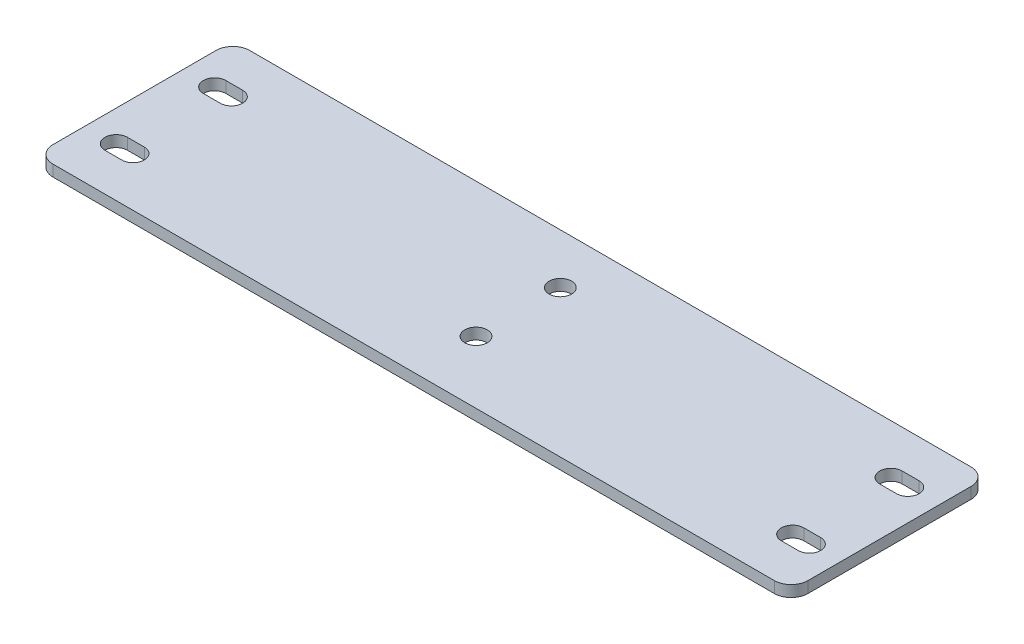
ISO-10303-21;
HEADER;
FILE_DESCRIPTION(('STEP AP214'),'2;1');
FILE_NAME('part.step','',(''),(''),'','','');
FILE_SCHEMA(('AUTOMOTIVE_DESIGN { 1 0 10303 214 1 1 1 1 }'));
ENDSEC;
DATA;
#1=APPLICATION_CONTEXT('core data for automotive mechanical design processes');
#2=APPLICATION_PROTOCOL_DEFINITION('international standard','automotive_design',2000,#1);
#3=PRODUCT_CONTEXT('',#1,'mechanical');
#4=PRODUCT('Part','Part','',(#3));
#5=PRODUCT_RELATED_PRODUCT_CATEGORY('part','',(#4));
#6=PRODUCT_DEFINITION_FORMATION('','',#4);
#7=PRODUCT_DEFINITION_CONTEXT('part definition',#1,'design');
#8=PRODUCT_DEFINITION('design','',#6,#7);
#9=PRODUCT_DEFINITION_SHAPE('','',#8);
#10=(LENGTH_UNIT() NAMED_UNIT(*) SI_UNIT(.MILLI.,.METRE.));
#11=(NAMED_UNIT(*) PLANE_ANGLE_UNIT() SI_UNIT($,.RADIAN.));
#12=(NAMED_UNIT(*) SI_UNIT($,.STERADIAN.) SOLID_ANGLE_UNIT());
#13=UNCERTAINTY_MEASURE_WITH_UNIT(LENGTH_MEASURE(1.E-05),#10,'distance_accuracy_value','');
#14=(GEOMETRIC_REPRESENTATION_CONTEXT(3) GLOBAL_UNCERTAINTY_ASSIGNED_CONTEXT((#13)) GLOBAL_UNIT_ASSIGNED_CONTEXT((#10,
#11,#12)) REPRESENTATION_CONTEXT('',''));
#15=CARTESIAN_POINT('',(0.,0.,0.));
#16=DIRECTION('',(0.,0.,1.));
#17=DIRECTION('',(1.,0.,0.));
#18=AXIS2_PLACEMENT_3D('',#15,#16,#17);
#19=CARTESIAN_POINT('',(64.15,-2.,14.5));
#20=DIRECTION('',(0.,1.,0.));
#21=DIRECTION('',(0.,0.,1.));
#22=AXIS2_PLACEMENT_3D('',#19,#20,#21);
#23=CYLINDRICAL_SURFACE('',#22,3.);
#24=CARTESIAN_POINT('',(64.15,0.,14.5));
#25=DIRECTION('',(0.,1.,0.));
#26=DIRECTION('',(0.,0.,1.));
#27=AXIS2_PLACEMENT_3D('',#24,#25,#26);
#28=CIRCLE('',#27,3.);
#29=CARTESIAN_POINT('',(64.15,0.,17.5));
#30=VERTEX_POINT('',#29);
#31=CARTESIAN_POINT('',(67.15,0.,14.5));
#32=VERTEX_POINT('',#31);
#33=EDGE_CURVE('E633',#30,#32,#28,.T.);
#34=ORIENTED_EDGE('',*,*,#33,.F.);
#35=DIRECTION('',(0.,1.,0.));
#36=VECTOR('',#35,1.);
#37=CARTESIAN_POINT('',(64.15,-2.,17.5));
#38=LINE('',#37,#36);
#39=CARTESIAN_POINT('',(64.15,-2.,17.5));
#40=VERTEX_POINT('',#39);
#41=EDGE_CURVE('E348',#40,#30,#38,.T.);
#42=ORIENTED_EDGE('',*,*,#41,.F.);
#43=CARTESIAN_POINT('',(64.15,-2.,14.5));
#44=DIRECTION('',(0.,1.,0.));
#45=DIRECTION('',(0.,0.,1.));
#46=AXIS2_PLACEMENT_3D('',#43,#44,#45);
#47=CIRCLE('',#46,3.);
#48=CARTESIAN_POINT('',(67.15,-2.,14.5));
#49=VERTEX_POINT('',#48);
#50=EDGE_CURVE('E634',#40,#49,#47,.T.);
#51=ORIENTED_EDGE('',*,*,#50,.T.);
#52=DIRECTION('',(0.,1.,0.));
#53=VECTOR('',#52,1.);
#54=CARTESIAN_POINT('',(67.15,-2.,14.5));
#55=LINE('',#54,#53);
#56=EDGE_CURVE('E659',#49,#32,#55,.T.);
#57=ORIENTED_EDGE('',*,*,#56,.T.);
#58=EDGE_LOOP('',(#34,#42,#51,#57));
#59=FACE_BOUND('',#58,.T.);
#60=ADVANCED_FACE('F340',(#59),#23,.T.);
#61=CARTESIAN_POINT('',(-64.15,-2.,17.5));
#62=DIRECTION('',(0.,0.,1.));
#63=DIRECTION('',(1.,0.,0.));
#64=AXIS2_PLACEMENT_3D('',#61,#62,#63);
#65=PLANE('',#64);
#66=DIRECTION('',(1.,0.,0.));
#67=VECTOR('',#66,1.);
#68=CARTESIAN_POINT('',(-64.15,0.,17.5));
#69=LINE('',#68,#67);
#70=CARTESIAN_POINT('',(-64.15,0.,17.5));
#71=VERTEX_POINT('',#70);
#72=EDGE_CURVE('E638',#71,#30,#69,.T.);
#73=ORIENTED_EDGE('',*,*,#72,.F.);
#74=DIRECTION('',(0.,1.,0.));
#75=VECTOR('',#74,1.);
#76=CARTESIAN_POINT('',(-64.15,-2.,17.5));
#77=LINE('',#76,#75);
#78=CARTESIAN_POINT('',(-64.15,-2.,17.5));
#79=VERTEX_POINT('',#78);
#80=EDGE_CURVE('E683',#79,#71,#77,.T.);
#81=ORIENTED_EDGE('',*,*,#80,.F.);
#82=DIRECTION('',(1.,0.,0.));
#83=VECTOR('',#82,1.);
#84=CARTESIAN_POINT('',(-64.15,-2.,17.5));
#85=LINE('',#84,#83);
#86=EDGE_CURVE('E656',#79,#40,#85,.T.);
#87=ORIENTED_EDGE('',*,*,#86,.T.);
#88=ORIENTED_EDGE('',*,*,#41,.T.);
#89=EDGE_LOOP('',(#73,#81,#87,#88));
#90=FACE_BOUND('',#89,.T.);
#91=ADVANCED_FACE('F707',(#90),#65,.T.);
#92=CARTESIAN_POINT('',(-64.15,-2.,14.5));
#93=DIRECTION('',(0.,1.,0.));
#94=DIRECTION('',(0.,0.,1.));
#95=AXIS2_PLACEMENT_3D('',#92,#93,#94);
#96=CYLINDRICAL_SURFACE('',#95,3.);
#97=CARTESIAN_POINT('',(-64.15,0.,14.5));
#98=DIRECTION('',(0.,1.,0.));
#99=DIRECTION('',(0.,0.,-1.));
#100=AXIS2_PLACEMENT_3D('',#97,#98,#99);
#101=CIRCLE('',#100,3.);
#102=CARTESIAN_POINT('',(-67.15,0.,14.5));
#103=VERTEX_POINT('',#102);
#104=EDGE_CURVE('E677',#103,#71,#101,.T.);
#105=ORIENTED_EDGE('',*,*,#104,.F.);
#106=DIRECTION('',(0.,1.,0.));
#107=VECTOR('',#106,1.);
#108=CARTESIAN_POINT('',(-67.15,-2.,14.5));
#109=LINE('',#108,#107);
#110=CARTESIAN_POINT('',(-67.15,-2.,14.5));
#111=VERTEX_POINT('',#110);
#112=EDGE_CURVE('E685',#111,#103,#109,.T.);
#113=ORIENTED_EDGE('',*,*,#112,.F.);
#114=CARTESIAN_POINT('',(-64.15,-2.,14.5));
#115=DIRECTION('',(0.,1.,0.));
#116=DIRECTION('',(0.,0.,-1.));
#117=AXIS2_PLACEMENT_3D('',#114,#115,#116);
#118=CIRCLE('',#117,3.);
#119=EDGE_CURVE('E653',#111,#79,#118,.T.);
#120=ORIENTED_EDGE('',*,*,#119,.T.);
#121=ORIENTED_EDGE('',*,*,#80,.T.);
#122=EDGE_LOOP('',(#105,#113,#120,#121));
#123=FACE_BOUND('',#122,.T.);
#124=ADVANCED_FACE('F728',(#123),#96,.T.);
#125=CARTESIAN_POINT('',(-67.15,-2.,-14.5));
#126=DIRECTION('',(-1.,0.,0.));
#127=DIRECTION('',(0.,0.,1.));
#128=AXIS2_PLACEMENT_3D('',#125,#126,#127);
#129=PLANE('',#128);
#130=DIRECTION('',(0.,0.,1.));
#131=VECTOR('',#130,1.);
#132=CARTESIAN_POINT('',(-67.15,0.,-14.5));
#133=LINE('',#132,#131);
#134=CARTESIAN_POINT('',(-67.15,0.,-14.5));
#135=VERTEX_POINT('',#134);
#136=EDGE_CURVE('E674',#135,#103,#133,.T.);
#137=ORIENTED_EDGE('',*,*,#136,.F.);
#138=DIRECTION('',(0.,1.,0.));
#139=VECTOR('',#138,1.);
#140=CARTESIAN_POINT('',(-67.15,-2.,-14.5));
#141=LINE('',#140,#139);
#142=CARTESIAN_POINT('',(-67.15,-2.,-14.5));
#143=VERTEX_POINT('',#142);
#144=EDGE_CURVE('E687',#143,#135,#141,.T.);
#145=ORIENTED_EDGE('',*,*,#144,.F.);
#146=DIRECTION('',(0.,0.,1.));
#147=VECTOR('',#146,1.);
#148=CARTESIAN_POINT('',(-67.15,-2.,-14.5));
#149=LINE('',#148,#147);
#150=EDGE_CURVE('E650',#143,#111,#149,.T.);
#151=ORIENTED_EDGE('',*,*,#150,.T.);
#152=ORIENTED_EDGE('',*,*,#112,.T.);
#153=EDGE_LOOP('',(#137,#145,#151,#152));
#154=FACE_BOUND('',#153,.T.);
#155=ADVANCED_FACE('F726',(#154),#129,.T.);
#156=CARTESIAN_POINT('',(-64.15,-2.,-14.5));
#157=DIRECTION('',(0.,1.,0.));
#158=DIRECTION('',(0.,0.,1.));
#159=AXIS2_PLACEMENT_3D('',#156,#157,#158);
#160=CYLINDRICAL_SURFACE('',#159,3.);
#161=CARTESIAN_POINT('',(-64.15,0.,-14.5));
#162=DIRECTION('',(0.,1.,0.));
#163=DIRECTION('',(0.,0.,-1.));
#164=AXIS2_PLACEMENT_3D('',#161,#162,#163);
#165=CIRCLE('',#164,3.);
#166=CARTESIAN_POINT('',(-64.15,0.,-17.5));
#167=VERTEX_POINT('',#166);
#168=EDGE_CURVE('E671',#167,#135,#165,.T.);
#169=ORIENTED_EDGE('',*,*,#168,.F.);
#170=DIRECTION('',(0.,1.,0.));
#171=VECTOR('',#170,1.);
#172=CARTESIAN_POINT('',(-64.15,-2.,-17.5));
#173=LINE('',#172,#171);
#174=CARTESIAN_POINT('',(-64.15,-2.,-17.5));
#175=VERTEX_POINT('',#174);
#176=EDGE_CURVE('E689',#175,#167,#173,.T.);
#177=ORIENTED_EDGE('',*,*,#176,.F.);
#178=CARTESIAN_POINT('',(-64.15,-2.,-14.5));
#179=DIRECTION('',(0.,1.,0.));
#180=DIRECTION('',(0.,0.,-1.));
#181=AXIS2_PLACEMENT_3D('',#178,#179,#180);
#182=CIRCLE('',#181,3.);
#183=EDGE_CURVE('E647',#175,#143,#182,.T.);
#184=ORIENTED_EDGE('',*,*,#183,.T.);
#185=ORIENTED_EDGE('',*,*,#144,.T.);
#186=EDGE_LOOP('',(#169,#177,#184,#185));
#187=FACE_BOUND('',#186,.T.);
#188=ADVANCED_FACE('F722',(#187),#160,.T.);
#189=CARTESIAN_POINT('',(-64.15,-2.,-17.5));
#190=DIRECTION('',(0.,0.,-1.));
#191=DIRECTION('',(-1.,0.,0.));
#192=AXIS2_PLACEMENT_3D('',#189,#190,#191);
#193=PLANE('',#192);
#194=DIRECTION('',(-1.,0.,0.));
#195=VECTOR('',#194,1.);
#196=CARTESIAN_POINT('',(-64.15,0.,-17.5));
#197=LINE('',#196,#195);
#198=CARTESIAN_POINT('',(64.15,0.,-17.5));
#199=VERTEX_POINT('',#198);
#200=EDGE_CURVE('E668',#199,#167,#197,.T.);
#201=ORIENTED_EDGE('',*,*,#200,.F.);
#202=DIRECTION('',(0.,1.,0.));
#203=VECTOR('',#202,1.);
#204=CARTESIAN_POINT('',(64.15,-2.,-17.5));
#205=LINE('',#204,#203);
#206=CARTESIAN_POINT('',(64.15,-2.,-17.5));
#207=VERTEX_POINT('',#206);
#208=EDGE_CURVE('E691',#207,#199,#205,.T.);
#209=ORIENTED_EDGE('',*,*,#208,.F.);
#210=DIRECTION('',(-1.,0.,0.));
#211=VECTOR('',#210,1.);
#212=CARTESIAN_POINT('',(-64.15,-2.,-17.5));
#213=LINE('',#212,#211);
#214=EDGE_CURVE('E644',#207,#175,#213,.T.);
#215=ORIENTED_EDGE('',*,*,#214,.T.);
#216=ORIENTED_EDGE('',*,*,#176,.T.);
#217=EDGE_LOOP('',(#201,#209,#215,#216));
#218=FACE_BOUND('',#217,.T.);
#219=ADVANCED_FACE('F720',(#218),#193,.T.);
#220=CARTESIAN_POINT('',(64.15,-2.,-14.5));
#221=DIRECTION('',(0.,1.,0.));
#222=DIRECTION('',(0.,0.,1.));
#223=AXIS2_PLACEMENT_3D('',#220,#221,#222);
#224=CYLINDRICAL_SURFACE('',#223,3.00000000000001);
#225=CARTESIAN_POINT('',(64.15,0.,-14.5));
#226=DIRECTION('',(0.,1.,0.));
#227=DIRECTION('',(0.,0.,1.));
#228=AXIS2_PLACEMENT_3D('',#225,#226,#227);
#229=CIRCLE('',#228,3.00000000000001);
#230=CARTESIAN_POINT('',(67.15,0.,-14.5));
#231=VERTEX_POINT('',#230);
#232=EDGE_CURVE('E665',#231,#199,#229,.T.);
#233=ORIENTED_EDGE('',*,*,#232,.F.);
#234=DIRECTION('',(0.,1.,0.));
#235=VECTOR('',#234,1.);
#236=CARTESIAN_POINT('',(67.15,-2.,-14.5));
#237=LINE('',#236,#235);
#238=CARTESIAN_POINT('',(67.15,-2.,-14.5));
#239=VERTEX_POINT('',#238);
#240=EDGE_CURVE('E693',#239,#231,#237,.T.);
#241=ORIENTED_EDGE('',*,*,#240,.F.);
#242=CARTESIAN_POINT('',(64.15,-2.,-14.5));
#243=DIRECTION('',(0.,1.,0.));
#244=DIRECTION('',(0.,0.,1.));
#245=AXIS2_PLACEMENT_3D('',#242,#243,#244);
#246=CIRCLE('',#245,3.00000000000001);
#247=EDGE_CURVE('E641',#239,#207,#246,.T.);
#248=ORIENTED_EDGE('',*,*,#247,.T.);
#249=ORIENTED_EDGE('',*,*,#208,.T.);
#250=EDGE_LOOP('',(#233,#241,#248,#249));
#251=FACE_BOUND('',#250,.T.);
#252=ADVANCED_FACE('F716',(#251),#224,.T.);
#253=CARTESIAN_POINT('',(67.15,-2.,-14.5));
#254=DIRECTION('',(1.,0.,0.));
#255=DIRECTION('',(0.,0.,-1.));
#256=AXIS2_PLACEMENT_3D('',#253,#254,#255);
#257=PLANE('',#256);
#258=DIRECTION('',(0.,0.,-1.));
#259=VECTOR('',#258,1.);
#260=CARTESIAN_POINT('',(67.15,0.,-14.5));
#261=LINE('',#260,#259);
#262=EDGE_CURVE('E662',#32,#231,#261,.T.);
#263=ORIENTED_EDGE('',*,*,#262,.F.);
#264=ORIENTED_EDGE('',*,*,#56,.F.);
#265=DIRECTION('',(0.,0.,-1.));
#266=VECTOR('',#265,1.);
#267=CARTESIAN_POINT('',(67.15,-2.,-14.5));
#268=LINE('',#267,#266);
#269=EDGE_CURVE('E637',#49,#239,#268,.T.);
#270=ORIENTED_EDGE('',*,*,#269,.T.);
#271=ORIENTED_EDGE('',*,*,#240,.T.);
#272=EDGE_LOOP('',(#263,#264,#270,#271));
#273=FACE_BOUND('',#272,.T.);
#274=ADVANCED_FACE('F701',(#273),#257,.T.);
#275=CARTESIAN_POINT('',(64.15,-2.,14.5));
#276=DIRECTION('',(0.,1.,0.));
#277=DIRECTION('',(0.,0.,1.));
#278=AXIS2_PLACEMENT_3D('',#275,#276,#277);
#279=PLANE('',#278);
#280=CARTESIAN_POINT('',(0.,-2.,-8.6));
#281=DIRECTION('',(0.,1.,0.));
#282=DIRECTION('',(0.,0.,1.));
#283=AXIS2_PLACEMENT_3D('',#280,#281,#282);
#284=CIRCLE('',#283,1.99999999999999);
#285=CARTESIAN_POINT('',(0.,-2.,-6.60000000000001));
#286=VERTEX_POINT('',#285);
#287=EDGE_CURVE('E1122',#286,#286,#284,.T.);
#288=ORIENTED_EDGE('',*,*,#287,.T.);
#289=EDGE_LOOP('',(#288));
#290=FACE_BOUND('',#289,.T.);
#291=CARTESIAN_POINT('',(0.,-2.,6.4));
#292=DIRECTION('',(0.,1.,0.));
#293=DIRECTION('',(0.,0.,1.));
#294=AXIS2_PLACEMENT_3D('',#291,#292,#293);
#295=CIRCLE('',#294,1.99999999999999);
#296=CARTESIAN_POINT('',(0.,-2.,8.39999999999999));
#297=VERTEX_POINT('',#296);
#298=EDGE_CURVE('E343',#297,#297,#295,.T.);
#299=ORIENTED_EDGE('',*,*,#298,.T.);
#300=EDGE_LOOP('',(#299));
#301=FACE_BOUND('',#300,.T.);
#302=DIRECTION('',(1.,0.,0.));
#303=VECTOR('',#302,1.);
#304=CARTESIAN_POINT('',(64.15,-2.,-6.75000000000001));
#305=LINE('',#304,#303);
#306=CARTESIAN_POINT('',(-61.65,-2.,-6.75000000000001));
#307=VERTEX_POINT('',#306);
#308=CARTESIAN_POINT('',(-58.65,-2.,-6.75000000000001));
#309=VERTEX_POINT('',#308);
#310=EDGE_CURVE('E530',#307,#309,#305,.T.);
#311=ORIENTED_EDGE('',*,*,#310,.T.);
#312=CARTESIAN_POINT('',(-58.65,-2.,-8.75));
#313=DIRECTION('',(0.,1.,0.));
#314=DIRECTION('',(0.,0.,1.));
#315=AXIS2_PLACEMENT_3D('',#312,#313,#314);
#316=CIRCLE('',#315,1.99999999999999);
#317=CARTESIAN_POINT('',(-58.65,-2.,-10.75));
#318=VERTEX_POINT('',#317);
#319=EDGE_CURVE('E534',#309,#318,#316,.T.);
#320=ORIENTED_EDGE('',*,*,#319,.T.);
#321=DIRECTION('',(-1.,0.,0.));
#322=VECTOR('',#321,1.);
#323=CARTESIAN_POINT('',(64.15,-2.,-10.75));
#324=LINE('',#323,#322);
#325=CARTESIAN_POINT('',(-61.65,-2.,-10.75));
#326=VERTEX_POINT('',#325);
#327=EDGE_CURVE('E504',#318,#326,#324,.T.);
#328=ORIENTED_EDGE('',*,*,#327,.T.);
#329=CARTESIAN_POINT('',(-61.65,-2.,-8.75));
#330=DIRECTION('',(0.,1.,0.));
#331=DIRECTION('',(0.,0.,1.));
#332=AXIS2_PLACEMENT_3D('',#329,#330,#331);
#333=CIRCLE('',#332,1.99999999999999);
#334=EDGE_CURVE('E13',#326,#307,#333,.T.);
#335=ORIENTED_EDGE('',*,*,#334,.T.);
#336=EDGE_LOOP('',(#311,#320,#328,#335));
#337=FACE_BOUND('',#336,.T.);
#338=CARTESIAN_POINT('',(-58.65,-2.,8.75));
#339=DIRECTION('',(0.,1.,0.));
#340=DIRECTION('',(0.,0.,1.));
#341=AXIS2_PLACEMENT_3D('',#338,#339,#340);
#342=CIRCLE('',#341,1.99999999999999);
#343=CARTESIAN_POINT('',(-58.65,-2.,10.75));
#344=VERTEX_POINT('',#343);
#345=CARTESIAN_POINT('',(-58.65,-2.,6.75000000000001));
#346=VERTEX_POINT('',#345);
#347=EDGE_CURVE('E565',#344,#346,#342,.T.);
#348=ORIENTED_EDGE('',*,*,#347,.T.);
#349=DIRECTION('',(-1.,0.,0.));
#350=VECTOR('',#349,1.);
#351=CARTESIAN_POINT('',(64.15,-2.,6.75000000000001));
#352=LINE('',#351,#350);
#353=CARTESIAN_POINT('',(-61.65,-2.,6.75000000000001));
#354=VERTEX_POINT('',#353);
#355=EDGE_CURVE('E556',#346,#354,#352,.T.);
#356=ORIENTED_EDGE('',*,*,#355,.T.);
#357=CARTESIAN_POINT('',(-61.65,-2.,8.75));
#358=DIRECTION('',(0.,1.,0.));
#359=DIRECTION('',(0.,0.,1.));
#360=AXIS2_PLACEMENT_3D('',#357,#358,#359);
#361=CIRCLE('',#360,1.99999999999999);
#362=CARTESIAN_POINT('',(-61.65,-2.,10.75));
#363=VERTEX_POINT('',#362);
#364=EDGE_CURVE('E559',#354,#363,#361,.T.);
#365=ORIENTED_EDGE('',*,*,#364,.T.);
#366=DIRECTION('',(1.,0.,0.));
#367=VECTOR('',#366,1.);
#368=CARTESIAN_POINT('',(64.15,-2.,10.75));
#369=LINE('',#368,#367);
#370=EDGE_CURVE('E562',#363,#344,#369,.T.);
#371=ORIENTED_EDGE('',*,*,#370,.T.);
#372=EDGE_LOOP('',(#348,#356,#365,#371));
#373=FACE_BOUND('',#372,.T.);
#374=DIRECTION('',(1.,0.,0.));
#375=VECTOR('',#374,1.);
#376=CARTESIAN_POINT('',(64.15,-2.,-6.75000000000001));
#377=LINE('',#376,#375);
#378=CARTESIAN_POINT('',(58.65,-2.,-6.75000000000001));
#379=VERTEX_POINT('',#378);
#380=CARTESIAN_POINT('',(61.65,-2.,-6.75000000000001));
#381=VERTEX_POINT('',#380);
#382=EDGE_CURVE('E592',#379,#381,#377,.T.);
#383=ORIENTED_EDGE('',*,*,#382,.T.);
#384=CARTESIAN_POINT('',(61.65,-2.,-8.75));
#385=DIRECTION('',(0.,1.,0.));
#386=DIRECTION('',(0.,0.,1.));
#387=AXIS2_PLACEMENT_3D('',#384,#385,#386);
#388=CIRCLE('',#387,1.99999999999999);
#389=CARTESIAN_POINT('',(61.65,-2.,-10.75));
#390=VERTEX_POINT('',#389);
#391=EDGE_CURVE('E598',#381,#390,#388,.T.);
#392=ORIENTED_EDGE('',*,*,#391,.T.);
#393=DIRECTION('',(-1.,0.,0.));
#394=VECTOR('',#393,1.);
#395=CARTESIAN_POINT('',(64.15,-2.,-10.75));
#396=LINE('',#395,#394);
#397=CARTESIAN_POINT('',(58.65,-2.,-10.75));
#398=VERTEX_POINT('',#397);
#399=EDGE_CURVE('E589',#390,#398,#396,.T.);
#400=ORIENTED_EDGE('',*,*,#399,.T.);
#401=CARTESIAN_POINT('',(58.65,-2.,-8.75));
#402=DIRECTION('',(0.,1.,0.));
#403=DIRECTION('',(0.,0.,1.));
#404=AXIS2_PLACEMENT_3D('',#401,#402,#403);
#405=CIRCLE('',#404,1.99999999999999);
#406=EDGE_CURVE('E595',#398,#379,#405,.T.);
#407=ORIENTED_EDGE('',*,*,#406,.T.);
#408=EDGE_LOOP('',(#383,#392,#400,#407));
#409=FACE_BOUND('',#408,.T.);
#410=CARTESIAN_POINT('',(58.65,-2.,8.75));
#411=DIRECTION('',(0.,1.,0.));
#412=DIRECTION('',(0.,0.,1.));
#413=AXIS2_PLACEMENT_3D('',#410,#411,#412);
#414=CIRCLE('',#413,1.99999999999999);
#415=CARTESIAN_POINT('',(58.65,-2.,6.75000000000001));
#416=VERTEX_POINT('',#415);
#417=CARTESIAN_POINT('',(58.65,-2.,10.75));
#418=VERTEX_POINT('',#417);
#419=EDGE_CURVE('E627',#416,#418,#414,.T.);
#420=ORIENTED_EDGE('',*,*,#419,.T.);
#421=DIRECTION('',(1.,0.,0.));
#422=VECTOR('',#421,1.);
#423=CARTESIAN_POINT('',(64.15,-2.,10.75));
#424=LINE('',#423,#422);
#425=CARTESIAN_POINT('',(61.65,-2.,10.75));
#426=VERTEX_POINT('',#425);
#427=EDGE_CURVE('E624',#418,#426,#424,.T.);
#428=ORIENTED_EDGE('',*,*,#427,.T.);
#429=CARTESIAN_POINT('',(61.65,-2.,8.75));
#430=DIRECTION('',(0.,1.,0.));
#431=DIRECTION('',(0.,0.,1.));
#432=AXIS2_PLACEMENT_3D('',#429,#430,#431);
#433=CIRCLE('',#432,1.99999999999999);
#434=CARTESIAN_POINT('',(61.65,-2.,6.75000000000001));
#435=VERTEX_POINT('',#434);
#436=EDGE_CURVE('E630',#426,#435,#433,.T.);
#437=ORIENTED_EDGE('',*,*,#436,.T.);
#438=DIRECTION('',(-1.,0.,0.));
#439=VECTOR('',#438,1.);
#440=CARTESIAN_POINT('',(64.15,-2.,6.75000000000001));
#441=LINE('',#440,#439);
#442=EDGE_CURVE('E621',#435,#416,#441,.T.);
#443=ORIENTED_EDGE('',*,*,#442,.T.);
#444=EDGE_LOOP('',(#420,#428,#437,#443));
#445=FACE_BOUND('',#444,.T.);
#446=ORIENTED_EDGE('',*,*,#50,.F.);
#447=ORIENTED_EDGE('',*,*,#86,.F.);
#448=ORIENTED_EDGE('',*,*,#119,.F.);
#449=ORIENTED_EDGE('',*,*,#150,.F.);
#450=ORIENTED_EDGE('',*,*,#183,.F.);
#451=ORIENTED_EDGE('',*,*,#214,.F.);
#452=ORIENTED_EDGE('',*,*,#247,.F.);
#453=ORIENTED_EDGE('',*,*,#269,.F.);
#454=EDGE_LOOP('',(#446,#447,#448,#449,#450,#451,#452,#453));
#455=FACE_BOUND('',#454,.T.);
#456=ADVANCED_FACE('F710',(#290,#301,#337,#373,#409,#445,#455),#279,.F.);
#457=CARTESIAN_POINT('',(64.15,0.,14.5));
#458=DIRECTION('',(0.,1.,0.));
#459=DIRECTION('',(0.,0.,1.));
#460=AXIS2_PLACEMENT_3D('',#457,#458,#459);
#461=PLANE('',#460);
#462=CARTESIAN_POINT('',(0.,0.,-8.6));
#463=DIRECTION('',(0.,1.,0.));
#464=DIRECTION('',(0.,0.,1.));
#465=AXIS2_PLACEMENT_3D('',#462,#463,#464);
#466=CIRCLE('',#465,1.99999999999999);
#467=CARTESIAN_POINT('',(0.,0.,-6.60000000000001));
#468=VERTEX_POINT('',#467);
#469=EDGE_CURVE('E1119',#468,#468,#466,.T.);
#470=ORIENTED_EDGE('',*,*,#469,.F.);
#471=EDGE_LOOP('',(#470));
#472=FACE_BOUND('',#471,.T.);
#473=CARTESIAN_POINT('',(0.,0.,6.4));
#474=DIRECTION('',(0.,1.,0.));
#475=DIRECTION('',(0.,0.,1.));
#476=AXIS2_PLACEMENT_3D('',#473,#474,#475);
#477=CIRCLE('',#476,1.99999999999999);
#478=CARTESIAN_POINT('',(0.,0.,8.39999999999999));
#479=VERTEX_POINT('',#478);
#480=EDGE_CURVE('E1123',#479,#479,#477,.T.);
#481=ORIENTED_EDGE('',*,*,#480,.F.);
#482=EDGE_LOOP('',(#481));
#483=FACE_BOUND('',#482,.T.);
#484=CARTESIAN_POINT('',(-58.65,0.,-8.75));
#485=DIRECTION('',(0.,1.,0.));
#486=DIRECTION('',(0.,0.,1.));
#487=AXIS2_PLACEMENT_3D('',#484,#485,#486);
#488=CIRCLE('',#487,1.99999999999999);
#489=CARTESIAN_POINT('',(-58.65,0.,-6.75000000000002));
#490=VERTEX_POINT('',#489);
#491=CARTESIAN_POINT('',(-58.65,0.,-10.75));
#492=VERTEX_POINT('',#491);
#493=EDGE_CURVE('E508',#490,#492,#488,.T.);
#494=ORIENTED_EDGE('',*,*,#493,.F.);
#495=DIRECTION('',(1.,0.,0.));
#496=VECTOR('',#495,1.);
#497=CARTESIAN_POINT('',(-61.65,0.,-6.75000000000002));
#498=LINE('',#497,#496);
#499=CARTESIAN_POINT('',(-61.65,0.,-6.75000000000001));
#500=VERTEX_POINT('',#499);
#501=EDGE_CURVE('E520',#500,#490,#498,.T.);
#502=ORIENTED_EDGE('',*,*,#501,.F.);
#503=CARTESIAN_POINT('',(-61.65,0.,-8.75));
#504=DIRECTION('',(0.,1.,0.));
#505=DIRECTION('',(0.,0.,1.));
#506=AXIS2_PLACEMENT_3D('',#503,#504,#505);
#507=CIRCLE('',#506,1.99999999999999);
#508=CARTESIAN_POINT('',(-61.65,0.,-10.75));
#509=VERTEX_POINT('',#508);
#510=EDGE_CURVE('E519',#509,#500,#507,.T.);
#511=ORIENTED_EDGE('',*,*,#510,.F.);
#512=DIRECTION('',(1.,0.,0.));
#513=VECTOR('',#512,1.);
#514=CARTESIAN_POINT('',(-61.65,0.,-10.75));
#515=LINE('',#514,#513);
#516=EDGE_CURVE('E501',#509,#492,#515,.T.);
#517=ORIENTED_EDGE('',*,*,#516,.T.);
#518=EDGE_LOOP('',(#494,#502,#511,#517));
#519=FACE_BOUND('',#518,.T.);
#520=CARTESIAN_POINT('',(-58.65,0.,8.75));
#521=DIRECTION('',(0.,1.,0.));
#522=DIRECTION('',(0.,0.,1.));
#523=AXIS2_PLACEMENT_3D('',#520,#521,#522);
#524=CIRCLE('',#523,1.99999999999999);
#525=CARTESIAN_POINT('',(-58.65,0.,10.7500000000001));
#526=VERTEX_POINT('',#525);
#527=CARTESIAN_POINT('',(-58.65,0.,6.75000000000001));
#528=VERTEX_POINT('',#527);
#529=EDGE_CURVE('E549',#526,#528,#524,.T.);
#530=ORIENTED_EDGE('',*,*,#529,.F.);
#531=DIRECTION('',(1.,0.,0.));
#532=VECTOR('',#531,1.);
#533=CARTESIAN_POINT('',(-61.65,0.,10.7500000000001));
#534=LINE('',#533,#532);
#535=CARTESIAN_POINT('',(-61.65,0.,10.75));
#536=VERTEX_POINT('',#535);
#537=EDGE_CURVE('E536',#536,#526,#534,.T.);
#538=ORIENTED_EDGE('',*,*,#537,.F.);
#539=CARTESIAN_POINT('',(-61.65,0.,8.75));
#540=DIRECTION('',(0.,1.,0.));
#541=DIRECTION('',(0.,0.,1.));
#542=AXIS2_PLACEMENT_3D('',#539,#540,#541);
#543=CIRCLE('',#542,1.99999999999999);
#544=CARTESIAN_POINT('',(-61.65,0.,6.75000000000001));
#545=VERTEX_POINT('',#544);
#546=EDGE_CURVE('E541',#545,#536,#543,.T.);
#547=ORIENTED_EDGE('',*,*,#546,.F.);
#548=DIRECTION('',(1.,0.,0.));
#549=VECTOR('',#548,1.);
#550=CARTESIAN_POINT('',(-61.65,0.,6.75000000000001));
#551=LINE('',#550,#549);
#552=EDGE_CURVE('E538',#545,#528,#551,.T.);
#553=ORIENTED_EDGE('',*,*,#552,.T.);
#554=EDGE_LOOP('',(#530,#538,#547,#553));
#555=FACE_BOUND('',#554,.T.);
#556=DIRECTION('',(1.,0.,0.));
#557=VECTOR('',#556,1.);
#558=CARTESIAN_POINT('',(58.65,0.,-6.75000000000002));
#559=LINE('',#558,#557);
#560=CARTESIAN_POINT('',(58.65,0.,-6.75000000000001));
#561=VERTEX_POINT('',#560);
#562=CARTESIAN_POINT('',(61.65,0.,-6.75000000000002));
#563=VERTEX_POINT('',#562);
#564=EDGE_CURVE('E568',#561,#563,#559,.T.);
#565=ORIENTED_EDGE('',*,*,#564,.F.);
#566=CARTESIAN_POINT('',(58.65,0.,-8.75));
#567=DIRECTION('',(0.,1.,0.));
#568=DIRECTION('',(0.,0.,1.));
#569=AXIS2_PLACEMENT_3D('',#566,#567,#568);
#570=CIRCLE('',#569,1.99999999999999);
#571=CARTESIAN_POINT('',(58.65,0.,-10.75));
#572=VERTEX_POINT('',#571);
#573=EDGE_CURVE('E573',#572,#561,#570,.T.);
#574=ORIENTED_EDGE('',*,*,#573,.F.);
#575=DIRECTION('',(1.,0.,0.));
#576=VECTOR('',#575,1.);
#577=CARTESIAN_POINT('',(58.65,0.,-10.75));
#578=LINE('',#577,#576);
#579=CARTESIAN_POINT('',(61.65,0.,-10.75));
#580=VERTEX_POINT('',#579);
#581=EDGE_CURVE('E570',#572,#580,#578,.T.);
#582=ORIENTED_EDGE('',*,*,#581,.T.);
#583=CARTESIAN_POINT('',(61.65,0.,-8.75));
#584=DIRECTION('',(0.,1.,0.));
#585=DIRECTION('',(0.,0.,1.));
#586=AXIS2_PLACEMENT_3D('',#583,#584,#585);
#587=CIRCLE('',#586,1.99999999999999);
#588=EDGE_CURVE('E581',#563,#580,#587,.T.);
#589=ORIENTED_EDGE('',*,*,#588,.F.);
#590=EDGE_LOOP('',(#565,#574,#582,#589));
#591=FACE_BOUND('',#590,.T.);
#592=DIRECTION('',(1.,0.,0.));
#593=VECTOR('',#592,1.);
#594=CARTESIAN_POINT('',(58.65,0.,10.7500000000001));
#595=LINE('',#594,#593);
#596=CARTESIAN_POINT('',(58.65,0.,10.75));
#597=VERTEX_POINT('',#596);
#598=CARTESIAN_POINT('',(61.65,0.,10.7500000000001));
#599=VERTEX_POINT('',#598);
#600=EDGE_CURVE('E601',#597,#599,#595,.T.);
#601=ORIENTED_EDGE('',*,*,#600,.F.);
#602=CARTESIAN_POINT('',(58.65,0.,8.75));
#603=DIRECTION('',(0.,1.,0.));
#604=DIRECTION('',(0.,0.,1.));
#605=AXIS2_PLACEMENT_3D('',#602,#603,#604);
#606=CIRCLE('',#605,1.99999999999999);
#607=CARTESIAN_POINT('',(58.65,0.,6.75000000000001));
#608=VERTEX_POINT('',#607);
#609=EDGE_CURVE('E606',#608,#597,#606,.T.);
#610=ORIENTED_EDGE('',*,*,#609,.F.);
#611=DIRECTION('',(1.,0.,0.));
#612=VECTOR('',#611,1.);
#613=CARTESIAN_POINT('',(58.65,0.,6.75000000000001));
#614=LINE('',#613,#612);
#615=CARTESIAN_POINT('',(61.65,0.,6.75000000000001));
#616=VERTEX_POINT('',#615);
#617=EDGE_CURVE('E603',#608,#616,#614,.T.);
#618=ORIENTED_EDGE('',*,*,#617,.T.);
#619=CARTESIAN_POINT('',(61.65,0.,8.75));
#620=DIRECTION('',(0.,1.,0.));
#621=DIRECTION('',(0.,0.,1.));
#622=AXIS2_PLACEMENT_3D('',#619,#620,#621);
#623=CIRCLE('',#622,1.99999999999999);
#624=EDGE_CURVE('E613',#599,#616,#623,.T.);
#625=ORIENTED_EDGE('',*,*,#624,.F.);
#626=EDGE_LOOP('',(#601,#610,#618,#625));
#627=FACE_BOUND('',#626,.T.);
#628=ORIENTED_EDGE('',*,*,#33,.T.);
#629=ORIENTED_EDGE('',*,*,#262,.T.);
#630=ORIENTED_EDGE('',*,*,#232,.T.);
#631=ORIENTED_EDGE('',*,*,#200,.T.);
#632=ORIENTED_EDGE('',*,*,#168,.T.);
#633=ORIENTED_EDGE('',*,*,#136,.T.);
#634=ORIENTED_EDGE('',*,*,#104,.T.);
#635=ORIENTED_EDGE('',*,*,#72,.T.);
#636=EDGE_LOOP('',(#628,#629,#630,#631,#632,#633,#634,#635));
#637=FACE_BOUND('',#636,.T.);
#638=ADVANCED_FACE('F517',(#472,#483,#519,#555,#591,#627,#637),#461,.T.);
#639=CARTESIAN_POINT('',(61.65,0.,8.75));
#640=DIRECTION('',(0.,1.,0.));
#641=DIRECTION('',(0.,0.,1.));
#642=AXIS2_PLACEMENT_3D('',#639,#640,#641);
#643=CYLINDRICAL_SURFACE('',#642,1.99999999999999);
#644=DIRECTION('',(0.,1.,0.));
#645=VECTOR('',#644,1.);
#646=CARTESIAN_POINT('',(61.65,0.,10.75));
#647=LINE('',#646,#645);
#648=EDGE_CURVE('E618',#599,#426,#647,.F.);
#649=ORIENTED_EDGE('',*,*,#648,.F.);
#650=ORIENTED_EDGE('',*,*,#624,.T.);
#651=DIRECTION('',(0.,1.,0.));
#652=VECTOR('',#651,1.);
#653=CARTESIAN_POINT('',(61.65,0.,6.75000000000001));
#654=LINE('',#653,#652);
#655=EDGE_CURVE('E615',#435,#616,#654,.T.);
#656=ORIENTED_EDGE('',*,*,#655,.F.);
#657=ORIENTED_EDGE('',*,*,#436,.F.);
#658=EDGE_LOOP('',(#649,#650,#656,#657));
#659=FACE_BOUND('',#658,.T.);
#660=ADVANCED_FACE('F805',(#659),#643,.F.);
#661=CARTESIAN_POINT('',(58.65,0.,8.75));
#662=DIRECTION('',(0.,1.,0.));
#663=DIRECTION('',(0.,0.,1.));
#664=AXIS2_PLACEMENT_3D('',#661,#662,#663);
#665=CYLINDRICAL_SURFACE('',#664,1.99999999999999);
#666=DIRECTION('',(0.,1.,0.));
#667=VECTOR('',#666,1.);
#668=CARTESIAN_POINT('',(58.65,0.,6.75000000000001));
#669=LINE('',#668,#667);
#670=EDGE_CURVE('E611',#608,#416,#669,.F.);
#671=ORIENTED_EDGE('',*,*,#670,.F.);
#672=ORIENTED_EDGE('',*,*,#609,.T.);
#673=DIRECTION('',(0.,1.,0.));
#674=VECTOR('',#673,1.);
#675=CARTESIAN_POINT('',(58.65,0.,10.75));
#676=LINE('',#675,#674);
#677=EDGE_CURVE('E609',#418,#597,#676,.T.);
#678=ORIENTED_EDGE('',*,*,#677,.F.);
#679=ORIENTED_EDGE('',*,*,#419,.F.);
#680=EDGE_LOOP('',(#671,#672,#678,#679));
#681=FACE_BOUND('',#680,.T.);
#682=ADVANCED_FACE('F815',(#681),#665,.F.);
#683=CARTESIAN_POINT('',(58.65,0.,10.75));
#684=DIRECTION('',(0.,0.,1.));
#685=DIRECTION('',(1.,0.,0.));
#686=AXIS2_PLACEMENT_3D('',#683,#684,#685);
#687=PLANE('',#686);
#688=ORIENTED_EDGE('',*,*,#677,.T.);
#689=ORIENTED_EDGE('',*,*,#600,.T.);
#690=ORIENTED_EDGE('',*,*,#648,.T.);
#691=ORIENTED_EDGE('',*,*,#427,.F.);
#692=EDGE_LOOP('',(#688,#689,#690,#691));
#693=FACE_BOUND('',#692,.T.);
#694=ADVANCED_FACE('F825',(#693),#687,.F.);
#695=CARTESIAN_POINT('',(58.65,0.,6.75000000000001));
#696=DIRECTION('',(0.,0.,-1.));
#697=DIRECTION('',(-1.,0.,0.));
#698=AXIS2_PLACEMENT_3D('',#695,#696,#697);
#699=PLANE('',#698);
#700=ORIENTED_EDGE('',*,*,#655,.T.);
#701=ORIENTED_EDGE('',*,*,#617,.F.);
#702=ORIENTED_EDGE('',*,*,#670,.T.);
#703=ORIENTED_EDGE('',*,*,#442,.F.);
#704=EDGE_LOOP('',(#700,#701,#702,#703));
#705=FACE_BOUND('',#704,.T.);
#706=ADVANCED_FACE('F835',(#705),#699,.F.);
#707=CARTESIAN_POINT('',(61.65,0.,-8.75));
#708=DIRECTION('',(0.,1.,0.));
#709=DIRECTION('',(0.,0.,1.));
#710=AXIS2_PLACEMENT_3D('',#707,#708,#709);
#711=CYLINDRICAL_SURFACE('',#710,1.99999999999999);
#712=DIRECTION('',(0.,1.,0.));
#713=VECTOR('',#712,1.);
#714=CARTESIAN_POINT('',(61.65,0.,-6.75000000000001));
#715=LINE('',#714,#713);
#716=EDGE_CURVE('E586',#563,#381,#715,.F.);
#717=ORIENTED_EDGE('',*,*,#716,.F.);
#718=ORIENTED_EDGE('',*,*,#588,.T.);
#719=DIRECTION('',(0.,1.,0.));
#720=VECTOR('',#719,1.);
#721=CARTESIAN_POINT('',(61.65,0.,-10.75));
#722=LINE('',#721,#720);
#723=EDGE_CURVE('E583',#390,#580,#722,.T.);
#724=ORIENTED_EDGE('',*,*,#723,.F.);
#725=ORIENTED_EDGE('',*,*,#391,.F.);
#726=EDGE_LOOP('',(#717,#718,#724,#725));
#727=FACE_BOUND('',#726,.T.);
#728=ADVANCED_FACE('F845',(#727),#711,.F.);
#729=CARTESIAN_POINT('',(58.65,0.,-8.75));
#730=DIRECTION('',(0.,1.,0.));
#731=DIRECTION('',(0.,0.,1.));
#732=AXIS2_PLACEMENT_3D('',#729,#730,#731);
#733=CYLINDRICAL_SURFACE('',#732,1.99999999999999);
#734=DIRECTION('',(0.,1.,0.));
#735=VECTOR('',#734,1.);
#736=CARTESIAN_POINT('',(58.65,0.,-10.75));
#737=LINE('',#736,#735);
#738=EDGE_CURVE('E578',#572,#398,#737,.F.);
#739=ORIENTED_EDGE('',*,*,#738,.F.);
#740=ORIENTED_EDGE('',*,*,#573,.T.);
#741=DIRECTION('',(0.,1.,0.));
#742=VECTOR('',#741,1.);
#743=CARTESIAN_POINT('',(58.65,0.,-6.75000000000001));
#744=LINE('',#743,#742);
#745=EDGE_CURVE('E576',#379,#561,#744,.T.);
#746=ORIENTED_EDGE('',*,*,#745,.F.);
#747=ORIENTED_EDGE('',*,*,#406,.F.);
#748=EDGE_LOOP('',(#739,#740,#746,#747));
#749=FACE_BOUND('',#748,.T.);
#750=ADVANCED_FACE('F855',(#749),#733,.F.);
#751=CARTESIAN_POINT('',(58.65,0.,-6.75000000000001));
#752=DIRECTION('',(0.,0.,1.));
#753=DIRECTION('',(1.,0.,0.));
#754=AXIS2_PLACEMENT_3D('',#751,#752,#753);
#755=PLANE('',#754);
#756=ORIENTED_EDGE('',*,*,#745,.T.);
#757=ORIENTED_EDGE('',*,*,#564,.T.);
#758=ORIENTED_EDGE('',*,*,#716,.T.);
#759=ORIENTED_EDGE('',*,*,#382,.F.);
#760=EDGE_LOOP('',(#756,#757,#758,#759));
#761=FACE_BOUND('',#760,.T.);
#762=ADVANCED_FACE('F865',(#761),#755,.F.);
#763=CARTESIAN_POINT('',(58.65,0.,-10.75));
#764=DIRECTION('',(0.,0.,-1.));
#765=DIRECTION('',(-1.,0.,0.));
#766=AXIS2_PLACEMENT_3D('',#763,#764,#765);
#767=PLANE('',#766);
#768=ORIENTED_EDGE('',*,*,#723,.T.);
#769=ORIENTED_EDGE('',*,*,#581,.F.);
#770=ORIENTED_EDGE('',*,*,#738,.T.);
#771=ORIENTED_EDGE('',*,*,#399,.F.);
#772=EDGE_LOOP('',(#768,#769,#770,#771));
#773=FACE_BOUND('',#772,.T.);
#774=ADVANCED_FACE('F875',(#773),#767,.F.);
#775=CARTESIAN_POINT('',(-58.65,0.,8.75));
#776=DIRECTION('',(0.,1.,0.));
#777=DIRECTION('',(0.,0.,1.));
#778=AXIS2_PLACEMENT_3D('',#775,#776,#777);
#779=CYLINDRICAL_SURFACE('',#778,1.99999999999999);
#780=DIRECTION('',(0.,1.,0.));
#781=VECTOR('',#780,1.);
#782=CARTESIAN_POINT('',(-58.65,0.,10.75));
#783=LINE('',#782,#781);
#784=EDGE_CURVE('E554',#526,#344,#783,.F.);
#785=ORIENTED_EDGE('',*,*,#784,.F.);
#786=ORIENTED_EDGE('',*,*,#529,.T.);
#787=DIRECTION('',(0.,1.,0.));
#788=VECTOR('',#787,1.);
#789=CARTESIAN_POINT('',(-58.65,0.,6.75000000000001));
#790=LINE('',#789,#788);
#791=EDGE_CURVE('E551',#346,#528,#790,.T.);
#792=ORIENTED_EDGE('',*,*,#791,.F.);
#793=ORIENTED_EDGE('',*,*,#347,.F.);
#794=EDGE_LOOP('',(#785,#786,#792,#793));
#795=FACE_BOUND('',#794,.T.);
#796=ADVANCED_FACE('F885',(#795),#779,.F.);
#797=CARTESIAN_POINT('',(-61.65,0.,10.75));
#798=DIRECTION('',(0.,0.,1.));
#799=DIRECTION('',(1.,0.,0.));
#800=AXIS2_PLACEMENT_3D('',#797,#798,#799);
#801=PLANE('',#800);
#802=DIRECTION('',(0.,1.,0.));
#803=VECTOR('',#802,1.);
#804=CARTESIAN_POINT('',(-61.65,0.,10.75));
#805=LINE('',#804,#803);
#806=EDGE_CURVE('E544',#363,#536,#805,.T.);
#807=ORIENTED_EDGE('',*,*,#806,.T.);
#808=ORIENTED_EDGE('',*,*,#537,.T.);
#809=ORIENTED_EDGE('',*,*,#784,.T.);
#810=ORIENTED_EDGE('',*,*,#370,.F.);
#811=EDGE_LOOP('',(#807,#808,#809,#810));
#812=FACE_BOUND('',#811,.T.);
#813=ADVANCED_FACE('F895',(#812),#801,.F.);
#814=CARTESIAN_POINT('',(-61.65,0.,8.75));
#815=DIRECTION('',(0.,1.,0.));
#816=DIRECTION('',(0.,0.,1.));
#817=AXIS2_PLACEMENT_3D('',#814,#815,#816);
#818=CYLINDRICAL_SURFACE('',#817,1.99999999999999);
#819=DIRECTION('',(0.,1.,0.));
#820=VECTOR('',#819,1.);
#821=CARTESIAN_POINT('',(-61.65,0.,6.75000000000001));
#822=LINE('',#821,#820);
#823=EDGE_CURVE('E546',#545,#354,#822,.F.);
#824=ORIENTED_EDGE('',*,*,#823,.F.);
#825=ORIENTED_EDGE('',*,*,#546,.T.);
#826=ORIENTED_EDGE('',*,*,#806,.F.);
#827=ORIENTED_EDGE('',*,*,#364,.F.);
#828=EDGE_LOOP('',(#824,#825,#826,#827));
#829=FACE_BOUND('',#828,.T.);
#830=ADVANCED_FACE('F905',(#829),#818,.F.);
#831=CARTESIAN_POINT('',(-61.65,0.,6.75000000000001));
#832=DIRECTION('',(0.,0.,-1.));
#833=DIRECTION('',(-1.,0.,0.));
#834=AXIS2_PLACEMENT_3D('',#831,#832,#833);
#835=PLANE('',#834);
#836=ORIENTED_EDGE('',*,*,#791,.T.);
#837=ORIENTED_EDGE('',*,*,#552,.F.);
#838=ORIENTED_EDGE('',*,*,#823,.T.);
#839=ORIENTED_EDGE('',*,*,#355,.F.);
#840=EDGE_LOOP('',(#836,#837,#838,#839));
#841=FACE_BOUND('',#840,.T.);
#842=ADVANCED_FACE('F915',(#841),#835,.F.);
#843=CARTESIAN_POINT('',(-61.65,0.,-8.75));
#844=DIRECTION('',(0.,1.,0.));
#845=DIRECTION('',(0.,0.,1.));
#846=AXIS2_PLACEMENT_3D('',#843,#844,#845);
#847=CYLINDRICAL_SURFACE('',#846,1.99999999999999);
#848=DIRECTION('',(0.,1.,0.));
#849=VECTOR('',#848,1.);
#850=CARTESIAN_POINT('',(-61.65,0.,-10.75));
#851=LINE('',#850,#849);
#852=EDGE_CURVE('E355',#509,#326,#851,.F.);
#853=ORIENTED_EDGE('',*,*,#852,.F.);
#854=ORIENTED_EDGE('',*,*,#510,.T.);
#855=DIRECTION('',(0.,1.,0.));
#856=VECTOR('',#855,1.);
#857=CARTESIAN_POINT('',(-61.65,0.,-6.75000000000001));
#858=LINE('',#857,#856);
#859=EDGE_CURVE('E522',#307,#500,#858,.T.);
#860=ORIENTED_EDGE('',*,*,#859,.F.);
#861=ORIENTED_EDGE('',*,*,#334,.F.);
#862=EDGE_LOOP('',(#853,#854,#860,#861));
#863=FACE_BOUND('',#862,.T.);
#864=ADVANCED_FACE('F925',(#863),#847,.F.);
#865=CARTESIAN_POINT('',(-58.65,0.,-8.75));
#866=DIRECTION('',(0.,1.,0.));
#867=DIRECTION('',(0.,0.,1.));
#868=AXIS2_PLACEMENT_3D('',#865,#866,#867);
#869=CYLINDRICAL_SURFACE('',#868,1.99999999999999);
#870=DIRECTION('',(0.,1.,0.));
#871=VECTOR('',#870,1.);
#872=CARTESIAN_POINT('',(-58.65,0.,-6.75000000000001));
#873=LINE('',#872,#871);
#874=EDGE_CURVE('E507',#490,#309,#873,.F.);
#875=ORIENTED_EDGE('',*,*,#874,.F.);
#876=ORIENTED_EDGE('',*,*,#493,.T.);
#877=DIRECTION('',(0.,1.,0.));
#878=VECTOR('',#877,1.);
#879=CARTESIAN_POINT('',(-58.65,0.,-10.75));
#880=LINE('',#879,#878);
#881=EDGE_CURVE('E497',#318,#492,#880,.T.);
#882=ORIENTED_EDGE('',*,*,#881,.F.);
#883=ORIENTED_EDGE('',*,*,#319,.F.);
#884=EDGE_LOOP('',(#875,#876,#882,#883));
#885=FACE_BOUND('',#884,.T.);
#886=ADVANCED_FACE('F512',(#885),#869,.F.);
#887=CARTESIAN_POINT('',(-61.65,0.,-10.75));
#888=DIRECTION('',(0.,0.,-1.));
#889=DIRECTION('',(-1.,0.,0.));
#890=AXIS2_PLACEMENT_3D('',#887,#888,#889);
#891=PLANE('',#890);
#892=ORIENTED_EDGE('',*,*,#881,.T.);
#893=ORIENTED_EDGE('',*,*,#516,.F.);
#894=ORIENTED_EDGE('',*,*,#852,.T.);
#895=ORIENTED_EDGE('',*,*,#327,.F.);
#896=EDGE_LOOP('',(#892,#893,#894,#895));
#897=FACE_BOUND('',#896,.T.);
#898=ADVANCED_FACE('F499',(#897),#891,.F.);
#899=CARTESIAN_POINT('',(-61.65,0.,-6.75000000000001));
#900=DIRECTION('',(0.,0.,1.));
#901=DIRECTION('',(1.,0.,0.));
#902=AXIS2_PLACEMENT_3D('',#899,#900,#901);
#903=PLANE('',#902);
#904=ORIENTED_EDGE('',*,*,#859,.T.);
#905=ORIENTED_EDGE('',*,*,#501,.T.);
#906=ORIENTED_EDGE('',*,*,#874,.T.);
#907=ORIENTED_EDGE('',*,*,#310,.F.);
#908=EDGE_LOOP('',(#904,#905,#906,#907));
#909=FACE_BOUND('',#908,.T.);
#910=ADVANCED_FACE('F951',(#909),#903,.F.);
#911=CARTESIAN_POINT('',(0.,0.,6.4));
#912=DIRECTION('',(0.,1.,0.));
#913=DIRECTION('',(0.,0.,1.));
#914=AXIS2_PLACEMENT_3D('',#911,#912,#913);
#915=CYLINDRICAL_SURFACE('',#914,1.99999999999999);
#916=ORIENTED_EDGE('',*,*,#480,.T.);
#917=EDGE_LOOP('',(#916));
#918=FACE_BOUND('',#917,.T.);
#919=ORIENTED_EDGE('',*,*,#298,.F.);
#920=EDGE_LOOP('',(#919));
#921=FACE_BOUND('',#920,.T.);
#922=ADVANCED_FACE('F959',(#918,#921),#915,.F.);
#923=CARTESIAN_POINT('',(0.,0.,-8.6));
#924=DIRECTION('',(0.,1.,0.));
#925=DIRECTION('',(0.,0.,1.));
#926=AXIS2_PLACEMENT_3D('',#923,#924,#925);
#927=CYLINDRICAL_SURFACE('',#926,1.99999999999999);
#928=ORIENTED_EDGE('',*,*,#469,.T.);
#929=EDGE_LOOP('',(#928));
#930=FACE_BOUND('',#929,.T.);
#931=ORIENTED_EDGE('',*,*,#287,.F.);
#932=EDGE_LOOP('',(#931));
#933=FACE_BOUND('',#932,.T.);
#934=ADVANCED_FACE('F968',(#930,#933),#927,.F.);
#935=CLOSED_SHELL('',(#60,#91,#124,#155,#188,#219,#252,#274,#456,#638,#660,#682,#694,#706,#728,
#750,#762,#774,#796,#813,#830,#842,#864,#886,#898,#910,#922,#934));
#936=MANIFOLD_SOLID_BREP('B2',#935);
#937=ADVANCED_BREP_SHAPE_REPRESENTATION('',(#18,#936),#14);
#938=SHAPE_DEFINITION_REPRESENTATION(#9,#937);
ENDSEC;
END-ISO-10303-21;
